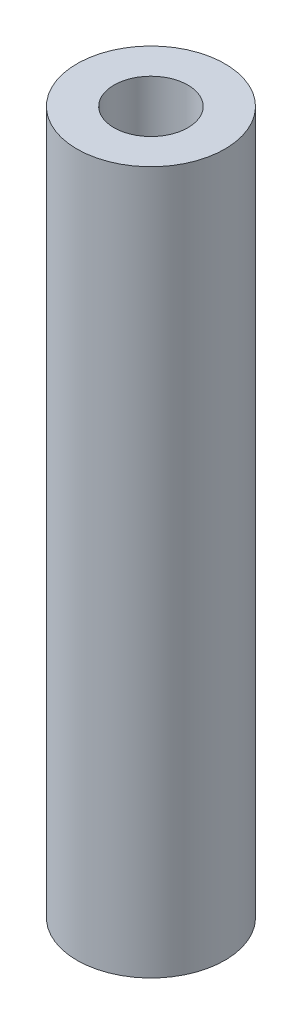
ISO-10303-21;
HEADER;
FILE_DESCRIPTION(('STEP AP214'),'2;1');
FILE_NAME('part.step','',(''),(''),'','','');
FILE_SCHEMA(('AUTOMOTIVE_DESIGN { 1 0 10303 214 1 1 1 1 }'));
ENDSEC;
DATA;
#1=APPLICATION_CONTEXT('core data for automotive mechanical design processes');
#2=APPLICATION_PROTOCOL_DEFINITION('international standard','automotive_design',2000,#1);
#3=PRODUCT_CONTEXT('',#1,'mechanical');
#4=PRODUCT('Part','Part','',(#3));
#5=PRODUCT_RELATED_PRODUCT_CATEGORY('part','',(#4));
#6=PRODUCT_DEFINITION_FORMATION('','',#4);
#7=PRODUCT_DEFINITION_CONTEXT('part definition',#1,'design');
#8=PRODUCT_DEFINITION('design','',#6,#7);
#9=PRODUCT_DEFINITION_SHAPE('','',#8);
#10=(LENGTH_UNIT() NAMED_UNIT(*) SI_UNIT(.MILLI.,.METRE.));
#11=(NAMED_UNIT(*) PLANE_ANGLE_UNIT() SI_UNIT($,.RADIAN.));
#12=(NAMED_UNIT(*) SI_UNIT($,.STERADIAN.) SOLID_ANGLE_UNIT());
#13=UNCERTAINTY_MEASURE_WITH_UNIT(LENGTH_MEASURE(1.E-05),#10,'distance_accuracy_value','');
#14=(GEOMETRIC_REPRESENTATION_CONTEXT(3) GLOBAL_UNCERTAINTY_ASSIGNED_CONTEXT((#13)) GLOBAL_UNIT_ASSIGNED_CONTEXT((#10,
#11,#12)) REPRESENTATION_CONTEXT('',''));
#15=CARTESIAN_POINT('',(0.,0.,0.));
#16=DIRECTION('',(0.,0.,1.));
#17=DIRECTION('',(1.,0.,0.));
#18=AXIS2_PLACEMENT_3D('',#15,#16,#17);
#19=CARTESIAN_POINT('',(0.,19.,0.));
#20=DIRECTION('',(0.,1.,0.));
#21=DIRECTION('',(0.,0.,1.));
#22=AXIS2_PLACEMENT_3D('',#19,#20,#21);
#23=PLANE('',#22);
#24=CARTESIAN_POINT('',(0.,19.,0.));
#25=DIRECTION('',(0.,1.,0.));
#26=DIRECTION('',(0.,0.,1.));
#27=AXIS2_PLACEMENT_3D('',#24,#25,#26);
#28=CIRCLE('',#27,2.);
#29=CARTESIAN_POINT('',(0.,19.,2.));
#30=VERTEX_POINT('',#29);
#31=EDGE_CURVE('E42',#30,#30,#28,.T.);
#32=ORIENTED_EDGE('',*,*,#31,.T.);
#33=EDGE_LOOP('',(#32));
#34=FACE_BOUND('',#33,.T.);
#35=CARTESIAN_POINT('',(0.,19.,0.));
#36=DIRECTION('',(0.,1.,0.));
#37=DIRECTION('',(0.,0.,1.));
#38=AXIS2_PLACEMENT_3D('',#35,#36,#37);
#39=CIRCLE('',#38,1.);
#40=CARTESIAN_POINT('',(0.,19.,1.));
#41=VERTEX_POINT('',#40);
#42=EDGE_CURVE('E50',#41,#41,#39,.T.);
#43=ORIENTED_EDGE('',*,*,#42,.F.);
#44=EDGE_LOOP('',(#43));
#45=FACE_BOUND('',#44,.T.);
#46=ADVANCED_FACE('F31',(#34,#45),#23,.T.);
#47=CARTESIAN_POINT('',(0.,0.,0.));
#48=DIRECTION('',(0.,1.,0.));
#49=DIRECTION('',(0.,0.,1.));
#50=AXIS2_PLACEMENT_3D('',#47,#48,#49);
#51=PLANE('',#50);
#52=CARTESIAN_POINT('',(0.,0.,0.));
#53=DIRECTION('',(0.,1.,0.));
#54=DIRECTION('',(0.,0.,1.));
#55=AXIS2_PLACEMENT_3D('',#52,#53,#54);
#56=CIRCLE('',#55,1.7279404685324);
#57=CARTESIAN_POINT('',(0.,0.,1.7279404685324));
#58=VERTEX_POINT('',#57);
#59=EDGE_CURVE('E38',#58,#58,#56,.T.);
#60=ORIENTED_EDGE('',*,*,#59,.T.);
#61=EDGE_LOOP('',(#60));
#62=FACE_BOUND('',#61,.T.);
#63=CARTESIAN_POINT('',(0.,0.,0.));
#64=DIRECTION('',(0.,1.,0.));
#65=DIRECTION('',(0.,0.,1.));
#66=AXIS2_PLACEMENT_3D('',#63,#64,#65);
#67=CIRCLE('',#66,2.);
#68=CARTESIAN_POINT('',(0.,0.,2.));
#69=VERTEX_POINT('',#68);
#70=EDGE_CURVE('E46',#69,#69,#67,.T.);
#71=ORIENTED_EDGE('',*,*,#70,.F.);
#72=EDGE_LOOP('',(#71));
#73=FACE_BOUND('',#72,.T.);
#74=ADVANCED_FACE('F58',(#62,#73),#51,.F.);
#75=CARTESIAN_POINT('',(0.,19.,0.));
#76=DIRECTION('',(0.,-1.,0.));
#77=DIRECTION('',(0.,0.,-1.));
#78=AXIS2_PLACEMENT_3D('',#75,#76,#77);
#79=CYLINDRICAL_SURFACE('',#78,2.);
#80=ORIENTED_EDGE('',*,*,#31,.F.);
#81=EDGE_LOOP('',(#80));
#82=FACE_BOUND('',#81,.T.);
#83=ORIENTED_EDGE('',*,*,#70,.T.);
#84=EDGE_LOOP('',(#83));
#85=FACE_BOUND('',#84,.T.);
#86=ADVANCED_FACE('F64',(#82,#85),#79,.T.);
#87=CARTESIAN_POINT('',(0.,19.,0.));
#88=DIRECTION('',(0.,-1.,0.));
#89=DIRECTION('',(0.,0.,-1.));
#90=AXIS2_PLACEMENT_3D('',#87,#88,#89);
#91=CYLINDRICAL_SURFACE('',#90,1.);
#92=CARTESIAN_POINT('',(0.,2.00000000000001,0.));
#93=DIRECTION('',(0.,1.,0.));
#94=DIRECTION('',(0.,0.,1.));
#95=AXIS2_PLACEMENT_3D('',#92,#93,#94);
#96=CIRCLE('',#95,1.);
#97=CARTESIAN_POINT('',(0.,2.00000000000001,1.));
#98=VERTEX_POINT('',#97);
#99=EDGE_CURVE('E10',#98,#98,#96,.F.);
#100=ORIENTED_EDGE('',*,*,#99,.T.);
#101=EDGE_LOOP('',(#100));
#102=FACE_BOUND('',#101,.T.);
#103=ORIENTED_EDGE('',*,*,#42,.T.);
#104=EDGE_LOOP('',(#103));
#105=FACE_BOUND('',#104,.T.);
#106=ADVANCED_FACE('F55',(#102,#105),#91,.F.);
#107=CARTESIAN_POINT('',(0.,0.,0.));
#108=DIRECTION('',(0.,-1.,0.));
#109=DIRECTION('',(0.,0.,-1.));
#110=AXIS2_PLACEMENT_3D('',#107,#108,#109);
#111=CONICAL_SURFACE('',#110,1.7279404685324,0.349065850398863);
#112=ORIENTED_EDGE('',*,*,#99,.F.);
#113=EDGE_LOOP('',(#112));
#114=FACE_BOUND('',#113,.T.);
#115=ORIENTED_EDGE('',*,*,#59,.F.);
#116=EDGE_LOOP('',(#115));
#117=FACE_BOUND('',#116,.T.);
#118=ADVANCED_FACE('F33',(#114,#117),#111,.F.);
#119=CLOSED_SHELL('',(#46,#74,#86,#106,#118));
#120=MANIFOLD_SOLID_BREP('B2',#119);
#121=ADVANCED_BREP_SHAPE_REPRESENTATION('',(#18,#120),#14);
#122=SHAPE_DEFINITION_REPRESENTATION(#9,#121);
ENDSEC;
END-ISO-10303-21;
